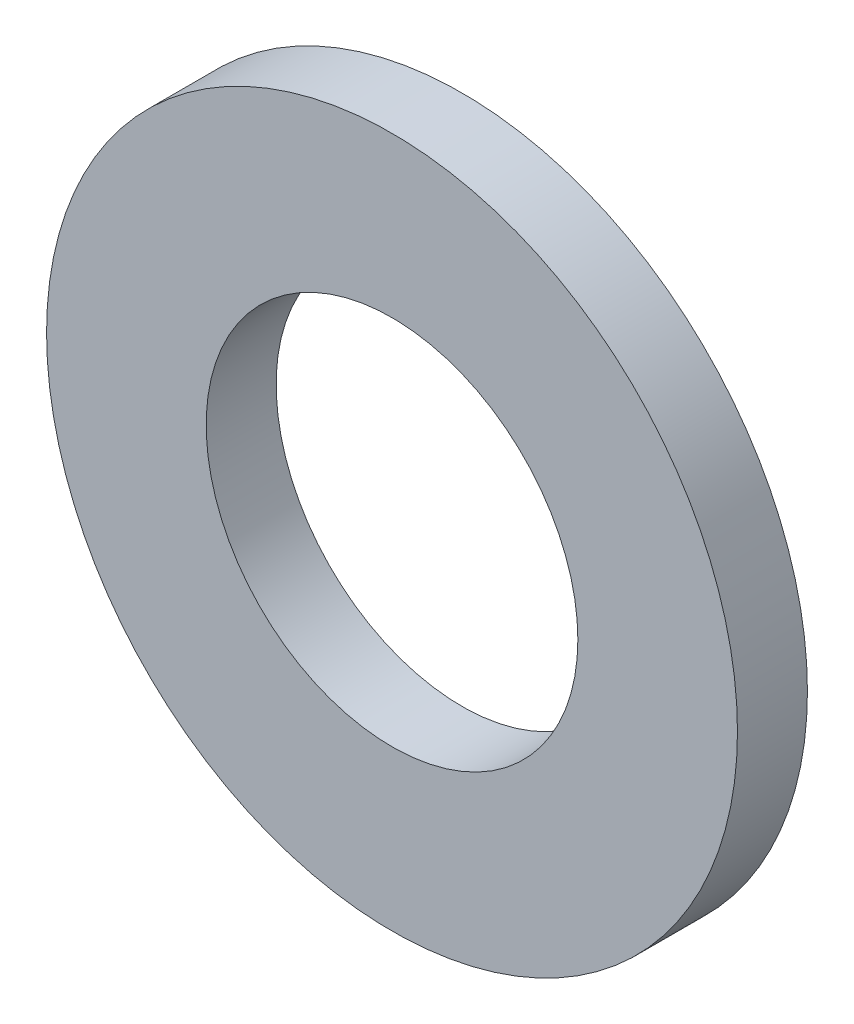
ISO-10303-21;
HEADER;
FILE_DESCRIPTION(('STEP AP214'),'2;1');
FILE_NAME('part.step','',(''),(''),'','','');
FILE_SCHEMA(('AUTOMOTIVE_DESIGN { 1 0 10303 214 1 1 1 1 }'));
ENDSEC;
DATA;
#1=APPLICATION_CONTEXT('core data for automotive mechanical design processes');
#2=APPLICATION_PROTOCOL_DEFINITION('international standard','automotive_design',2000,#1);
#3=PRODUCT_CONTEXT('',#1,'mechanical');
#4=PRODUCT('Part','Part','',(#3));
#5=PRODUCT_RELATED_PRODUCT_CATEGORY('part','',(#4));
#6=PRODUCT_DEFINITION_FORMATION('','',#4);
#7=PRODUCT_DEFINITION_CONTEXT('part definition',#1,'design');
#8=PRODUCT_DEFINITION('design','',#6,#7);
#9=PRODUCT_DEFINITION_SHAPE('','',#8);
#10=(LENGTH_UNIT() NAMED_UNIT(*) SI_UNIT(.MILLI.,.METRE.));
#11=(NAMED_UNIT(*) PLANE_ANGLE_UNIT() SI_UNIT($,.RADIAN.));
#12=(NAMED_UNIT(*) SI_UNIT($,.STERADIAN.) SOLID_ANGLE_UNIT());
#13=UNCERTAINTY_MEASURE_WITH_UNIT(LENGTH_MEASURE(1.E-05),#10,'distance_accuracy_value','');
#14=(GEOMETRIC_REPRESENTATION_CONTEXT(3) GLOBAL_UNCERTAINTY_ASSIGNED_CONTEXT((#13)) GLOBAL_UNIT_ASSIGNED_CONTEXT((#10,
#11,#12)) REPRESENTATION_CONTEXT('',''));
#15=CARTESIAN_POINT('',(0.,0.,0.));
#16=DIRECTION('',(0.,0.,1.));
#17=DIRECTION('',(1.,0.,0.));
#18=AXIS2_PLACEMENT_3D('',#15,#16,#17);
#19=CARTESIAN_POINT('',(0.,0.,0.8));
#20=DIRECTION('',(0.,0.,1.));
#21=DIRECTION('',(1.,0.,0.));
#22=AXIS2_PLACEMENT_3D('',#19,#20,#21);
#23=PLANE('',#22);
#24=CARTESIAN_POINT('',(0.,0.,0.8));
#25=DIRECTION('',(0.,0.,1.));
#26=DIRECTION('',(1.,0.,0.));
#27=AXIS2_PLACEMENT_3D('',#24,#25,#26);
#28=CIRCLE('',#27,7.9);
#29=CARTESIAN_POINT('',(7.9,0.,0.8));
#30=VERTEX_POINT('',#29);
#31=EDGE_CURVE('E10',#30,#30,#28,.T.);
#32=ORIENTED_EDGE('',*,*,#31,.T.);
#33=EDGE_LOOP('',(#32));
#34=FACE_BOUND('',#33,.T.);
#35=CARTESIAN_POINT('',(0.,0.,0.8));
#36=DIRECTION('',(0.,0.,1.));
#37=DIRECTION('',(1.,0.,0.));
#38=AXIS2_PLACEMENT_3D('',#35,#36,#37);
#39=CIRCLE('',#38,4.25);
#40=CARTESIAN_POINT('',(4.25,0.,0.8));
#41=VERTEX_POINT('',#40);
#42=EDGE_CURVE('E41',#41,#41,#39,.T.);
#43=ORIENTED_EDGE('',*,*,#42,.F.);
#44=EDGE_LOOP('',(#43));
#45=FACE_BOUND('',#44,.T.);
#46=ADVANCED_FACE('F30',(#34,#45),#23,.T.);
#47=CARTESIAN_POINT('',(0.,0.,-0.8));
#48=DIRECTION('',(0.,0.,1.));
#49=DIRECTION('',(1.,0.,0.));
#50=AXIS2_PLACEMENT_3D('',#47,#48,#49);
#51=PLANE('',#50);
#52=CARTESIAN_POINT('',(0.,0.,-0.8));
#53=DIRECTION('',(0.,0.,1.));
#54=DIRECTION('',(1.,0.,0.));
#55=AXIS2_PLACEMENT_3D('',#52,#53,#54);
#56=CIRCLE('',#55,7.9);
#57=CARTESIAN_POINT('',(7.9,0.,-0.8));
#58=VERTEX_POINT('',#57);
#59=EDGE_CURVE('E34',#58,#58,#56,.T.);
#60=ORIENTED_EDGE('',*,*,#59,.F.);
#61=EDGE_LOOP('',(#60));
#62=FACE_BOUND('',#61,.T.);
#63=CARTESIAN_POINT('',(0.,0.,-0.8));
#64=DIRECTION('',(0.,0.,1.));
#65=DIRECTION('',(1.,0.,0.));
#66=AXIS2_PLACEMENT_3D('',#63,#64,#65);
#67=CIRCLE('',#66,4.25);
#68=CARTESIAN_POINT('',(4.25,0.,-0.8));
#69=VERTEX_POINT('',#68);
#70=EDGE_CURVE('E43',#69,#69,#67,.T.);
#71=ORIENTED_EDGE('',*,*,#70,.T.);
#72=EDGE_LOOP('',(#71));
#73=FACE_BOUND('',#72,.T.);
#74=ADVANCED_FACE('F53',(#62,#73),#51,.F.);
#75=CARTESIAN_POINT('',(0.,0.,0.8));
#76=DIRECTION('',(0.,0.,-1.));
#77=DIRECTION('',(-1.,0.,0.));
#78=AXIS2_PLACEMENT_3D('',#75,#76,#77);
#79=CYLINDRICAL_SURFACE('',#78,7.9);
#80=ORIENTED_EDGE('',*,*,#31,.F.);
#81=EDGE_LOOP('',(#80));
#82=FACE_BOUND('',#81,.T.);
#83=ORIENTED_EDGE('',*,*,#59,.T.);
#84=EDGE_LOOP('',(#83));
#85=FACE_BOUND('',#84,.T.);
#86=ADVANCED_FACE('F32',(#82,#85),#79,.T.);
#87=CARTESIAN_POINT('',(0.,0.,0.8));
#88=DIRECTION('',(0.,0.,-1.));
#89=DIRECTION('',(-1.,0.,0.));
#90=AXIS2_PLACEMENT_3D('',#87,#88,#89);
#91=CYLINDRICAL_SURFACE('',#90,4.25);
#92=ORIENTED_EDGE('',*,*,#42,.T.);
#93=EDGE_LOOP('',(#92));
#94=FACE_BOUND('',#93,.T.);
#95=ORIENTED_EDGE('',*,*,#70,.F.);
#96=EDGE_LOOP('',(#95));
#97=FACE_BOUND('',#96,.T.);
#98=ADVANCED_FACE('F49',(#94,#97),#91,.F.);
#99=CLOSED_SHELL('',(#46,#74,#86,#98));
#100=MANIFOLD_SOLID_BREP('B2',#99);
#101=ADVANCED_BREP_SHAPE_REPRESENTATION('',(#18,#100),#14);
#102=SHAPE_DEFINITION_REPRESENTATION(#9,#101);
ENDSEC;
END-ISO-10303-21;
